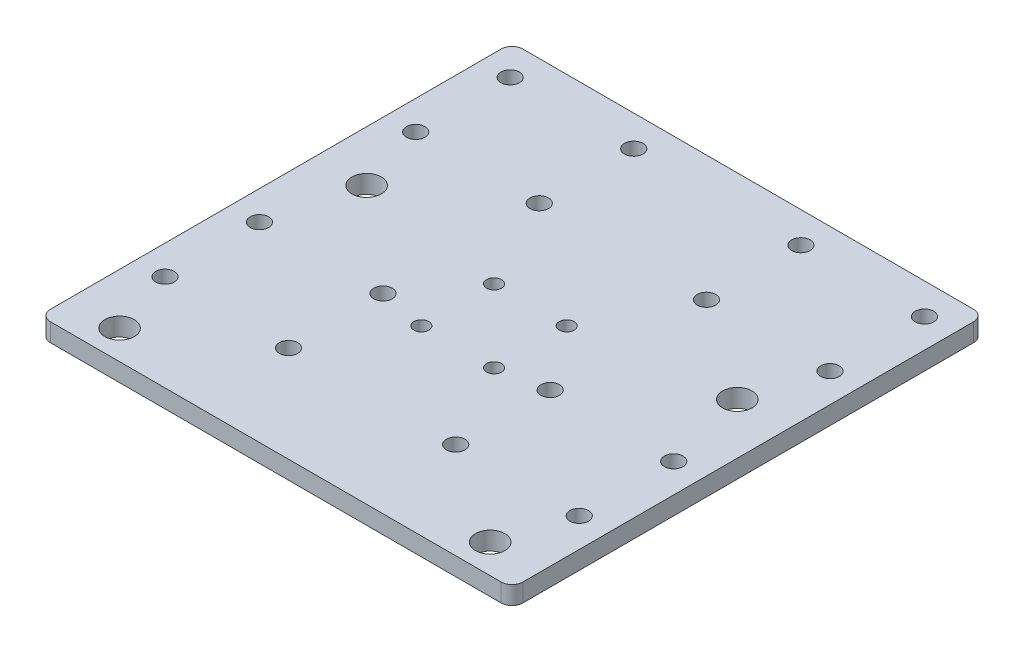
ISO-10303-21;
HEADER;
FILE_DESCRIPTION(('STEP AP214'),'2;1');
FILE_NAME('part.step','',(''),(''),'','','');
FILE_SCHEMA(('AUTOMOTIVE_DESIGN { 1 0 10303 214 1 1 1 1 }'));
ENDSEC;
DATA;
#1=APPLICATION_CONTEXT('core data for automotive mechanical design processes');
#2=APPLICATION_PROTOCOL_DEFINITION('international standard','automotive_design',2000,#1);
#3=PRODUCT_CONTEXT('',#1,'mechanical');
#4=PRODUCT('Part','Part','',(#3));
#5=PRODUCT_RELATED_PRODUCT_CATEGORY('part','',(#4));
#6=PRODUCT_DEFINITION_FORMATION('','',#4);
#7=PRODUCT_DEFINITION_CONTEXT('part definition',#1,'design');
#8=PRODUCT_DEFINITION('design','',#6,#7);
#9=PRODUCT_DEFINITION_SHAPE('','',#8);
#10=(LENGTH_UNIT() NAMED_UNIT(*) SI_UNIT(.MILLI.,.METRE.));
#11=(NAMED_UNIT(*) PLANE_ANGLE_UNIT() SI_UNIT($,.RADIAN.));
#12=(NAMED_UNIT(*) SI_UNIT($,.STERADIAN.) SOLID_ANGLE_UNIT());
#13=UNCERTAINTY_MEASURE_WITH_UNIT(LENGTH_MEASURE(1.E-05),#10,'distance_accuracy_value','');
#14=(GEOMETRIC_REPRESENTATION_CONTEXT(3) GLOBAL_UNCERTAINTY_ASSIGNED_CONTEXT((#13)) GLOBAL_UNIT_ASSIGNED_CONTEXT((#10,
#11,#12)) REPRESENTATION_CONTEXT('',''));
#15=CARTESIAN_POINT('',(0.,0.,0.));
#16=DIRECTION('',(0.,0.,1.));
#17=DIRECTION('',(1.,0.,0.));
#18=AXIS2_PLACEMENT_3D('',#15,#16,#17);
#19=CARTESIAN_POINT('',(0.,5.,0.));
#20=DIRECTION('',(1.,0.,0.));
#21=DIRECTION('',(0.,0.,-1.));
#22=AXIS2_PLACEMENT_3D('',#19,#20,#21);
#23=PLANE('',#22);
#24=DIRECTION('',(0.,0.,1.));
#25=VECTOR('',#24,1.);
#26=CARTESIAN_POINT('',(0.,0.,0.));
#27=LINE('',#26,#25);
#28=CARTESIAN_POINT('',(0.,0.,3.));
#29=VERTEX_POINT('',#28);
#30=CARTESIAN_POINT('',(0.,0.,127.));
#31=VERTEX_POINT('',#30);
#32=EDGE_CURVE('E127',#29,#31,#27,.T.);
#33=ORIENTED_EDGE('',*,*,#32,.T.);
#34=DIRECTION('',(0.,-1.,0.));
#35=VECTOR('',#34,1.);
#36=CARTESIAN_POINT('',(0.,5.,127.));
#37=LINE('',#36,#35);
#38=CARTESIAN_POINT('',(0.,5.,127.));
#39=VERTEX_POINT('',#38);
#40=EDGE_CURVE('E227',#31,#39,#37,.F.);
#41=ORIENTED_EDGE('',*,*,#40,.T.);
#42=DIRECTION('',(0.,0.,1.));
#43=VECTOR('',#42,1.);
#44=CARTESIAN_POINT('',(0.,5.,0.));
#45=LINE('',#44,#43);
#46=CARTESIAN_POINT('',(0.,5.,3.));
#47=VERTEX_POINT('',#46);
#48=EDGE_CURVE('E125',#47,#39,#45,.T.);
#49=ORIENTED_EDGE('',*,*,#48,.F.);
#50=DIRECTION('',(0.,-1.,0.));
#51=VECTOR('',#50,1.);
#52=CARTESIAN_POINT('',(0.,5.,3.));
#53=LINE('',#52,#51);
#54=EDGE_CURVE('E224',#47,#29,#53,.T.);
#55=ORIENTED_EDGE('',*,*,#54,.T.);
#56=EDGE_LOOP('',(#33,#41,#49,#55));
#57=FACE_BOUND('',#56,.T.);
#58=ADVANCED_FACE('F32',(#57),#23,.F.);
#59=CARTESIAN_POINT('',(0.,5.,130.));
#60=DIRECTION('',(0.,0.,-1.));
#61=DIRECTION('',(-1.,0.,0.));
#62=AXIS2_PLACEMENT_3D('',#59,#60,#61);
#63=PLANE('',#62);
#64=DIRECTION('',(1.,0.,0.));
#65=VECTOR('',#64,1.);
#66=CARTESIAN_POINT('',(0.,0.,130.));
#67=LINE('',#66,#65);
#68=CARTESIAN_POINT('',(3.00000000000002,0.,130.));
#69=VERTEX_POINT('',#68);
#70=CARTESIAN_POINT('',(127.,0.,130.));
#71=VERTEX_POINT('',#70);
#72=EDGE_CURVE('E123',#69,#71,#67,.T.);
#73=ORIENTED_EDGE('',*,*,#72,.T.);
#74=DIRECTION('',(0.,-1.,0.));
#75=VECTOR('',#74,1.);
#76=CARTESIAN_POINT('',(127.,5.,130.));
#77=LINE('',#76,#75);
#78=CARTESIAN_POINT('',(127.,5.,130.));
#79=VERTEX_POINT('',#78);
#80=EDGE_CURVE('E102',#71,#79,#77,.F.);
#81=ORIENTED_EDGE('',*,*,#80,.T.);
#82=DIRECTION('',(1.,0.,0.));
#83=VECTOR('',#82,1.);
#84=CARTESIAN_POINT('',(0.,5.,130.));
#85=LINE('',#84,#83);
#86=CARTESIAN_POINT('',(3.00000000000002,5.,130.));
#87=VERTEX_POINT('',#86);
#88=EDGE_CURVE('E243',#87,#79,#85,.T.);
#89=ORIENTED_EDGE('',*,*,#88,.F.);
#90=DIRECTION('',(0.,-1.,0.));
#91=VECTOR('',#90,1.);
#92=CARTESIAN_POINT('',(3.00000000000002,5.,130.));
#93=LINE('',#92,#91);
#94=EDGE_CURVE('E107',#87,#69,#93,.T.);
#95=ORIENTED_EDGE('',*,*,#94,.T.);
#96=EDGE_LOOP('',(#73,#81,#89,#95));
#97=FACE_BOUND('',#96,.T.);
#98=ADVANCED_FACE('F268',(#97),#63,.F.);
#99=CARTESIAN_POINT('',(130.,5.,0.));
#100=DIRECTION('',(-1.,0.,0.));
#101=DIRECTION('',(0.,0.,1.));
#102=AXIS2_PLACEMENT_3D('',#99,#100,#101);
#103=PLANE('',#102);
#104=DIRECTION('',(0.,0.,-1.));
#105=VECTOR('',#104,1.);
#106=CARTESIAN_POINT('',(130.,5.,0.));
#107=LINE('',#106,#105);
#108=CARTESIAN_POINT('',(130.,5.,127.));
#109=VERTEX_POINT('',#108);
#110=CARTESIAN_POINT('',(130.,5.,3.));
#111=VERTEX_POINT('',#110);
#112=EDGE_CURVE('E116',#109,#111,#107,.T.);
#113=ORIENTED_EDGE('',*,*,#112,.F.);
#114=DIRECTION('',(0.,-1.,0.));
#115=VECTOR('',#114,1.);
#116=CARTESIAN_POINT('',(130.,5.,127.));
#117=LINE('',#116,#115);
#118=CARTESIAN_POINT('',(130.,0.,127.));
#119=VERTEX_POINT('',#118);
#120=EDGE_CURVE('E101',#109,#119,#117,.T.);
#121=ORIENTED_EDGE('',*,*,#120,.T.);
#122=DIRECTION('',(0.,0.,-1.));
#123=VECTOR('',#122,1.);
#124=CARTESIAN_POINT('',(130.,0.,0.));
#125=LINE('',#124,#123);
#126=CARTESIAN_POINT('',(130.,0.,3.));
#127=VERTEX_POINT('',#126);
#128=EDGE_CURVE('E114',#119,#127,#125,.T.);
#129=ORIENTED_EDGE('',*,*,#128,.T.);
#130=DIRECTION('',(0.,-1.,0.));
#131=VECTOR('',#130,1.);
#132=CARTESIAN_POINT('',(130.,5.,3.));
#133=LINE('',#132,#131);
#134=EDGE_CURVE('E118',#127,#111,#133,.F.);
#135=ORIENTED_EDGE('',*,*,#134,.T.);
#136=EDGE_LOOP('',(#113,#121,#129,#135));
#137=FACE_BOUND('',#136,.T.);
#138=ADVANCED_FACE('F113',(#137),#103,.F.);
#139=CARTESIAN_POINT('',(0.,5.,0.));
#140=DIRECTION('',(0.,0.,1.));
#141=DIRECTION('',(1.,0.,0.));
#142=AXIS2_PLACEMENT_3D('',#139,#140,#141);
#143=PLANE('',#142);
#144=DIRECTION('',(-1.,0.,0.));
#145=VECTOR('',#144,1.);
#146=CARTESIAN_POINT('',(0.,0.,0.));
#147=LINE('',#146,#145);
#148=CARTESIAN_POINT('',(127.,0.,0.));
#149=VERTEX_POINT('',#148);
#150=CARTESIAN_POINT('',(3.,0.,0.));
#151=VERTEX_POINT('',#150);
#152=EDGE_CURVE('E122',#149,#151,#147,.T.);
#153=ORIENTED_EDGE('',*,*,#152,.T.);
#154=DIRECTION('',(0.,-1.,0.));
#155=VECTOR('',#154,1.);
#156=CARTESIAN_POINT('',(3.,5.,0.));
#157=LINE('',#156,#155);
#158=CARTESIAN_POINT('',(3.,5.,0.));
#159=VERTEX_POINT('',#158);
#160=EDGE_CURVE('E11',#151,#159,#157,.F.);
#161=ORIENTED_EDGE('',*,*,#160,.T.);
#162=DIRECTION('',(-1.,0.,0.));
#163=VECTOR('',#162,1.);
#164=CARTESIAN_POINT('',(0.,5.,0.));
#165=LINE('',#164,#163);
#166=CARTESIAN_POINT('',(127.,5.,0.));
#167=VERTEX_POINT('',#166);
#168=EDGE_CURVE('E208',#167,#159,#165,.T.);
#169=ORIENTED_EDGE('',*,*,#168,.F.);
#170=DIRECTION('',(0.,-1.,0.));
#171=VECTOR('',#170,1.);
#172=CARTESIAN_POINT('',(127.,5.,0.));
#173=LINE('',#172,#171);
#174=EDGE_CURVE('E40',#167,#149,#173,.T.);
#175=ORIENTED_EDGE('',*,*,#174,.T.);
#176=EDGE_LOOP('',(#153,#161,#169,#175));
#177=FACE_BOUND('',#176,.T.);
#178=ADVANCED_FACE('F230',(#177),#143,.F.);
#179=CARTESIAN_POINT('',(0.,5.,0.));
#180=DIRECTION('',(0.,1.,0.));
#181=DIRECTION('',(0.,0.,1.));
#182=AXIS2_PLACEMENT_3D('',#179,#180,#181);
#183=PLANE('',#182);
#184=CARTESIAN_POINT('',(122.002540725745,5.,103.5));
#185=DIRECTION('',(0.,1.,0.));
#186=DIRECTION('',(0.,0.,1.));
#187=AXIS2_PLACEMENT_3D('',#184,#185,#186);
#188=CIRCLE('',#187,2.54999999999999);
#189=CARTESIAN_POINT('',(122.002540725745,5.,106.05));
#190=VERTEX_POINT('',#189);
#191=EDGE_CURVE('E621',#190,#190,#188,.T.);
#192=ORIENTED_EDGE('',*,*,#191,.F.);
#193=EDGE_LOOP('',(#192));
#194=FACE_BOUND('',#193,.T.);
#195=CARTESIAN_POINT('',(122.002540725745,5.,77.5));
#196=DIRECTION('',(0.,1.,0.));
#197=DIRECTION('',(0.,0.,1.));
#198=AXIS2_PLACEMENT_3D('',#195,#196,#197);
#199=CIRCLE('',#198,2.54999999999999);
#200=CARTESIAN_POINT('',(122.002540725745,5.,80.05));
#201=VERTEX_POINT('',#200);
#202=EDGE_CURVE('E636',#201,#201,#199,.T.);
#203=ORIENTED_EDGE('',*,*,#202,.F.);
#204=EDGE_LOOP('',(#203));
#205=FACE_BOUND('',#204,.T.);
#206=CARTESIAN_POINT('',(122.002540725745,5.,8.49999999999997));
#207=DIRECTION('',(0.,1.,0.));
#208=DIRECTION('',(0.,0.,1.));
#209=AXIS2_PLACEMENT_3D('',#206,#207,#208);
#210=CIRCLE('',#209,2.54999999999999);
#211=CARTESIAN_POINT('',(122.002540725745,5.,11.05));
#212=VERTEX_POINT('',#211);
#213=EDGE_CURVE('E633',#212,#212,#210,.T.);
#214=ORIENTED_EDGE('',*,*,#213,.F.);
#215=EDGE_LOOP('',(#214));
#216=FACE_BOUND('',#215,.T.);
#217=CARTESIAN_POINT('',(122.002540725745,5.,34.5));
#218=DIRECTION('',(0.,1.,0.));
#219=DIRECTION('',(0.,0.,1.));
#220=AXIS2_PLACEMENT_3D('',#217,#218,#219);
#221=CIRCLE('',#220,2.54999999999999);
#222=CARTESIAN_POINT('',(122.002540725745,5.,37.05));
#223=VERTEX_POINT('',#222);
#224=EDGE_CURVE('E629',#223,#223,#221,.T.);
#225=ORIENTED_EDGE('',*,*,#224,.F.);
#226=EDGE_LOOP('',(#225));
#227=FACE_BOUND('',#226,.T.);
#228=CARTESIAN_POINT('',(88.002540725745,5.,34.5));
#229=DIRECTION('',(0.,1.,0.));
#230=DIRECTION('',(0.,0.,1.));
#231=AXIS2_PLACEMENT_3D('',#228,#229,#230);
#232=CIRCLE('',#231,2.54999999999999);
#233=CARTESIAN_POINT('',(88.002540725745,5.,37.05));
#234=VERTEX_POINT('',#233);
#235=EDGE_CURVE('E626',#234,#234,#232,.T.);
#236=ORIENTED_EDGE('',*,*,#235,.F.);
#237=EDGE_LOOP('',(#236));
#238=FACE_BOUND('',#237,.T.);
#239=CARTESIAN_POINT('',(55.,5.,79.9415754864367));
#240=DIRECTION('',(0.,1.,0.));
#241=DIRECTION('',(0.,0.,1.));
#242=AXIS2_PLACEMENT_3D('',#239,#240,#241);
#243=CIRCLE('',#242,2.04999999999999);
#244=CARTESIAN_POINT('',(55.,5.,81.9915754864367));
#245=VERTEX_POINT('',#244);
#246=EDGE_CURVE('E647',#245,#245,#243,.T.);
#247=ORIENTED_EDGE('',*,*,#246,.F.);
#248=EDGE_LOOP('',(#247));
#249=FACE_BOUND('',#248,.T.);
#250=CARTESIAN_POINT('',(75.,5.,79.9415754864367));
#251=DIRECTION('',(0.,1.,0.));
#252=DIRECTION('',(0.,0.,1.));
#253=AXIS2_PLACEMENT_3D('',#250,#251,#252);
#254=CIRCLE('',#253,2.04999999999999);
#255=CARTESIAN_POINT('',(75.,5.,81.9915754864367));
#256=VERTEX_POINT('',#255);
#257=EDGE_CURVE('E650',#256,#256,#254,.T.);
#258=ORIENTED_EDGE('',*,*,#257,.F.);
#259=EDGE_LOOP('',(#258));
#260=FACE_BOUND('',#259,.T.);
#261=CARTESIAN_POINT('',(75.,5.,59.9415754864368));
#262=DIRECTION('',(0.,1.,0.));
#263=DIRECTION('',(0.,0.,1.));
#264=AXIS2_PLACEMENT_3D('',#261,#262,#263);
#265=CIRCLE('',#264,2.04999999999999);
#266=CARTESIAN_POINT('',(75.,5.,61.9915754864368));
#267=VERTEX_POINT('',#266);
#268=EDGE_CURVE('E644',#267,#267,#265,.T.);
#269=ORIENTED_EDGE('',*,*,#268,.F.);
#270=EDGE_LOOP('',(#269));
#271=FACE_BOUND('',#270,.T.);
#272=CARTESIAN_POINT('',(55.,5.,59.9415754864368));
#273=DIRECTION('',(0.,1.,0.));
#274=DIRECTION('',(0.,0.,1.));
#275=AXIS2_PLACEMENT_3D('',#272,#273,#274);
#276=CIRCLE('',#275,2.04999999999999);
#277=CARTESIAN_POINT('',(55.,5.,61.9915754864368));
#278=VERTEX_POINT('',#277);
#279=EDGE_CURVE('E641',#278,#278,#276,.T.);
#280=ORIENTED_EDGE('',*,*,#279,.F.);
#281=EDGE_LOOP('',(#280));
#282=FACE_BOUND('',#281,.T.);
#283=CARTESIAN_POINT('',(88.002540725745,5.,8.49999999999998));
#284=DIRECTION('',(0.,1.,0.));
#285=DIRECTION('',(0.,0.,1.));
#286=AXIS2_PLACEMENT_3D('',#283,#284,#285);
#287=CIRCLE('',#286,2.54999999999999);
#288=CARTESIAN_POINT('',(88.002540725745,5.,11.05));
#289=VERTEX_POINT('',#288);
#290=EDGE_CURVE('E630',#289,#289,#287,.T.);
#291=ORIENTED_EDGE('',*,*,#290,.F.);
#292=EDGE_LOOP('',(#291));
#293=FACE_BOUND('',#292,.T.);
#294=CARTESIAN_POINT('',(7.99745927425499,5.,77.5));
#295=DIRECTION('',(0.,1.,0.));
#296=DIRECTION('',(0.,0.,1.));
#297=AXIS2_PLACEMENT_3D('',#294,#295,#296);
#298=CIRCLE('',#297,2.55);
#299=CARTESIAN_POINT('',(7.99745927425499,5.,80.05));
#300=VERTEX_POINT('',#299);
#301=EDGE_CURVE('E605',#300,#300,#298,.T.);
#302=ORIENTED_EDGE('',*,*,#301,.F.);
#303=EDGE_LOOP('',(#302));
#304=FACE_BOUND('',#303,.T.);
#305=CARTESIAN_POINT('',(7.99745927425497,5.,34.5));
#306=DIRECTION('',(0.,1.,0.));
#307=DIRECTION('',(0.,0.,1.));
#308=AXIS2_PLACEMENT_3D('',#305,#306,#307);
#309=CIRCLE('',#308,2.55);
#310=CARTESIAN_POINT('',(7.99745927425497,5.,37.05));
#311=VERTEX_POINT('',#310);
#312=EDGE_CURVE('E602',#311,#311,#309,.T.);
#313=ORIENTED_EDGE('',*,*,#312,.F.);
#314=EDGE_LOOP('',(#313));
#315=FACE_BOUND('',#314,.T.);
#316=CARTESIAN_POINT('',(7.99745927425497,5.,8.49999999999999));
#317=DIRECTION('',(0.,1.,0.));
#318=DIRECTION('',(0.,0.,1.));
#319=AXIS2_PLACEMENT_3D('',#316,#317,#318);
#320=CIRCLE('',#319,2.55);
#321=CARTESIAN_POINT('',(7.99745927425497,5.,11.05));
#322=VERTEX_POINT('',#321);
#323=EDGE_CURVE('E599',#322,#322,#320,.T.);
#324=ORIENTED_EDGE('',*,*,#323,.F.);
#325=EDGE_LOOP('',(#324));
#326=FACE_BOUND('',#325,.T.);
#327=CARTESIAN_POINT('',(41.997459274255,5.,34.5));
#328=DIRECTION('',(0.,1.,0.));
#329=DIRECTION('',(0.,0.,1.));
#330=AXIS2_PLACEMENT_3D('',#327,#328,#329);
#331=CIRCLE('',#330,2.55);
#332=CARTESIAN_POINT('',(41.997459274255,5.,37.05));
#333=VERTEX_POINT('',#332);
#334=EDGE_CURVE('E154',#333,#333,#331,.T.);
#335=ORIENTED_EDGE('',*,*,#334,.F.);
#336=EDGE_LOOP('',(#335));
#337=FACE_BOUND('',#336,.T.);
#338=CARTESIAN_POINT('',(88.002540725745,5.,103.5));
#339=DIRECTION('',(0.,1.,0.));
#340=DIRECTION('',(0.,0.,1.));
#341=AXIS2_PLACEMENT_3D('',#338,#339,#340);
#342=CIRCLE('',#341,2.54999999999999);
#343=CARTESIAN_POINT('',(88.002540725745,5.,106.05));
#344=VERTEX_POINT('',#343);
#345=EDGE_CURVE('E617',#344,#344,#342,.T.);
#346=ORIENTED_EDGE('',*,*,#345,.F.);
#347=EDGE_LOOP('',(#346));
#348=FACE_BOUND('',#347,.T.);
#349=CARTESIAN_POINT('',(88.0025407257451,5.,77.5));
#350=DIRECTION('',(0.,1.,0.));
#351=DIRECTION('',(0.,0.,1.));
#352=AXIS2_PLACEMENT_3D('',#349,#350,#351);
#353=CIRCLE('',#352,2.54999999999999);
#354=CARTESIAN_POINT('',(88.0025407257451,5.,80.05));
#355=VERTEX_POINT('',#354);
#356=EDGE_CURVE('E620',#355,#355,#353,.T.);
#357=ORIENTED_EDGE('',*,*,#356,.F.);
#358=EDGE_LOOP('',(#357));
#359=FACE_BOUND('',#358,.T.);
#360=CARTESIAN_POINT('',(7.99745927425498,5.,103.5));
#361=DIRECTION('',(0.,1.,0.));
#362=DIRECTION('',(0.,0.,1.));
#363=AXIS2_PLACEMENT_3D('',#360,#361,#362);
#364=CIRCLE('',#363,2.55);
#365=CARTESIAN_POINT('',(7.99745927425498,5.,106.05));
#366=VERTEX_POINT('',#365);
#367=EDGE_CURVE('E614',#366,#366,#364,.T.);
#368=ORIENTED_EDGE('',*,*,#367,.F.);
#369=EDGE_LOOP('',(#368));
#370=FACE_BOUND('',#369,.T.);
#371=CARTESIAN_POINT('',(41.997459274255,5.,103.5));
#372=DIRECTION('',(0.,1.,0.));
#373=DIRECTION('',(0.,0.,1.));
#374=AXIS2_PLACEMENT_3D('',#371,#372,#373);
#375=CIRCLE('',#374,2.55);
#376=CARTESIAN_POINT('',(41.997459274255,5.,106.05));
#377=VERTEX_POINT('',#376);
#378=EDGE_CURVE('E611',#377,#377,#375,.T.);
#379=ORIENTED_EDGE('',*,*,#378,.F.);
#380=EDGE_LOOP('',(#379));
#381=FACE_BOUND('',#380,.T.);
#382=CARTESIAN_POINT('',(41.997459274255,5.,77.5));
#383=DIRECTION('',(0.,1.,0.));
#384=DIRECTION('',(0.,0.,1.));
#385=AXIS2_PLACEMENT_3D('',#382,#383,#384);
#386=CIRCLE('',#385,2.55);
#387=CARTESIAN_POINT('',(41.997459274255,5.,80.05));
#388=VERTEX_POINT('',#387);
#389=EDGE_CURVE('E608',#388,#388,#386,.T.);
#390=ORIENTED_EDGE('',*,*,#389,.F.);
#391=EDGE_LOOP('',(#390));
#392=FACE_BOUND('',#391,.T.);
#393=CARTESIAN_POINT('',(41.997459274255,5.,8.49999999999999));
#394=DIRECTION('',(0.,1.,0.));
#395=DIRECTION('',(0.,0.,1.));
#396=AXIS2_PLACEMENT_3D('',#393,#394,#395);
#397=CIRCLE('',#396,2.55);
#398=CARTESIAN_POINT('',(41.997459274255,5.,11.05));
#399=VERTEX_POINT('',#398);
#400=EDGE_CURVE('E149',#399,#399,#397,.T.);
#401=ORIENTED_EDGE('',*,*,#400,.F.);
#402=EDGE_LOOP('',(#401));
#403=FACE_BOUND('',#402,.T.);
#404=CARTESIAN_POINT('',(116.,5.,53.9999999999999));
#405=DIRECTION('',(0.,1.,0.));
#406=DIRECTION('',(0.,0.,1.));
#407=AXIS2_PLACEMENT_3D('',#404,#405,#406);
#408=CIRCLE('',#407,4.05);
#409=CARTESIAN_POINT('',(116.,5.,58.0499999999999));
#410=VERTEX_POINT('',#409);
#411=EDGE_CURVE('E139',#410,#410,#408,.T.);
#412=ORIENTED_EDGE('',*,*,#411,.F.);
#413=EDGE_LOOP('',(#412));
#414=FACE_BOUND('',#413,.T.);
#415=CARTESIAN_POINT('',(116.,5.,122.));
#416=DIRECTION('',(0.,1.,0.));
#417=DIRECTION('',(0.,0.,1.));
#418=AXIS2_PLACEMENT_3D('',#415,#416,#417);
#419=CIRCLE('',#418,4.05);
#420=CARTESIAN_POINT('',(116.,5.,126.05));
#421=VERTEX_POINT('',#420);
#422=EDGE_CURVE('E591',#421,#421,#419,.T.);
#423=ORIENTED_EDGE('',*,*,#422,.F.);
#424=EDGE_LOOP('',(#423));
#425=FACE_BOUND('',#424,.T.);
#426=CARTESIAN_POINT('',(14.0000000000008,5.,121.999999999998));
#427=DIRECTION('',(0.,1.,0.));
#428=DIRECTION('',(0.,0.,1.));
#429=AXIS2_PLACEMENT_3D('',#426,#427,#428);
#430=CIRCLE('',#429,4.05);
#431=CARTESIAN_POINT('',(14.0000000000008,5.,126.049999999998));
#432=VERTEX_POINT('',#431);
#433=EDGE_CURVE('E148',#432,#432,#430,.T.);
#434=ORIENTED_EDGE('',*,*,#433,.F.);
#435=EDGE_LOOP('',(#434));
#436=FACE_BOUND('',#435,.T.);
#437=CARTESIAN_POINT('',(14.0000000000002,5.,54.0000000000003));
#438=DIRECTION('',(0.,1.,0.));
#439=DIRECTION('',(0.,0.,1.));
#440=AXIS2_PLACEMENT_3D('',#437,#438,#439);
#441=CIRCLE('',#440,4.05);
#442=CARTESIAN_POINT('',(14.0000000000002,5.,58.0500000000003));
#443=VERTEX_POINT('',#442);
#444=EDGE_CURVE('E134',#443,#443,#441,.T.);
#445=ORIENTED_EDGE('',*,*,#444,.F.);
#446=EDGE_LOOP('',(#445));
#447=FACE_BOUND('',#446,.T.);
#448=ORIENTED_EDGE('',*,*,#88,.T.);
#449=CARTESIAN_POINT('',(127.,5.,127.));
#450=DIRECTION('',(0.,1.,0.));
#451=DIRECTION('',(0.,0.,1.));
#452=AXIS2_PLACEMENT_3D('',#449,#450,#451);
#453=CIRCLE('',#452,3.);
#454=EDGE_CURVE('E222',#79,#109,#453,.T.);
#455=ORIENTED_EDGE('',*,*,#454,.T.);
#456=ORIENTED_EDGE('',*,*,#112,.T.);
#457=CARTESIAN_POINT('',(127.,5.,3.));
#458=DIRECTION('',(0.,1.,0.));
#459=DIRECTION('',(0.,0.,1.));
#460=AXIS2_PLACEMENT_3D('',#457,#458,#459);
#461=CIRCLE('',#460,3.);
#462=EDGE_CURVE('E52',#111,#167,#461,.T.);
#463=ORIENTED_EDGE('',*,*,#462,.T.);
#464=ORIENTED_EDGE('',*,*,#168,.T.);
#465=CARTESIAN_POINT('',(3.,5.,3.));
#466=DIRECTION('',(0.,1.,0.));
#467=DIRECTION('',(0.,0.,1.));
#468=AXIS2_PLACEMENT_3D('',#465,#466,#467);
#469=CIRCLE('',#468,3.);
#470=EDGE_CURVE('E218',#159,#47,#469,.T.);
#471=ORIENTED_EDGE('',*,*,#470,.T.);
#472=ORIENTED_EDGE('',*,*,#48,.T.);
#473=CARTESIAN_POINT('',(3.00000000000002,5.,127.));
#474=DIRECTION('',(0.,1.,0.));
#475=DIRECTION('',(0.,0.,1.));
#476=AXIS2_PLACEMENT_3D('',#473,#474,#475);
#477=CIRCLE('',#476,3.);
#478=EDGE_CURVE('E220',#39,#87,#477,.T.);
#479=ORIENTED_EDGE('',*,*,#478,.T.);
#480=EDGE_LOOP('',(#448,#455,#456,#463,#464,#471,#472,#479));
#481=FACE_BOUND('',#480,.T.);
#482=ADVANCED_FACE('F251',(#194,#205,#216,#227,#238,#249,#260,#271,#282,#293,#304,#315,#326,
#337,#348,#359,#370,#381,#392,#403,#414,#425,#436,#447,#481),#183,.T.);
#483=CARTESIAN_POINT('',(0.,0.,0.));
#484=DIRECTION('',(0.,1.,0.));
#485=DIRECTION('',(0.,0.,1.));
#486=AXIS2_PLACEMENT_3D('',#483,#484,#485);
#487=PLANE('',#486);
#488=CARTESIAN_POINT('',(122.002540725745,0.,103.5));
#489=DIRECTION('',(0.,1.,0.));
#490=DIRECTION('',(0.,0.,1.));
#491=AXIS2_PLACEMENT_3D('',#488,#489,#490);
#492=CIRCLE('',#491,2.54999999999999);
#493=CARTESIAN_POINT('',(122.002540725745,0.,106.05));
#494=VERTEX_POINT('',#493);
#495=EDGE_CURVE('E205',#494,#494,#492,.T.);
#496=ORIENTED_EDGE('',*,*,#495,.T.);
#497=EDGE_LOOP('',(#496));
#498=FACE_BOUND('',#497,.T.);
#499=CARTESIAN_POINT('',(122.002540725745,0.,77.5));
#500=DIRECTION('',(0.,1.,0.));
#501=DIRECTION('',(0.,0.,1.));
#502=AXIS2_PLACEMENT_3D('',#499,#500,#501);
#503=CIRCLE('',#502,2.54999999999999);
#504=CARTESIAN_POINT('',(122.002540725745,0.,80.05));
#505=VERTEX_POINT('',#504);
#506=EDGE_CURVE('E202',#505,#505,#503,.T.);
#507=ORIENTED_EDGE('',*,*,#506,.T.);
#508=EDGE_LOOP('',(#507));
#509=FACE_BOUND('',#508,.T.);
#510=CARTESIAN_POINT('',(122.002540725745,0.,8.49999999999997));
#511=DIRECTION('',(0.,1.,0.));
#512=DIRECTION('',(0.,0.,1.));
#513=AXIS2_PLACEMENT_3D('',#510,#511,#512);
#514=CIRCLE('',#513,2.54999999999999);
#515=CARTESIAN_POINT('',(122.002540725745,0.,11.05));
#516=VERTEX_POINT('',#515);
#517=EDGE_CURVE('E199',#516,#516,#514,.T.);
#518=ORIENTED_EDGE('',*,*,#517,.T.);
#519=EDGE_LOOP('',(#518));
#520=FACE_BOUND('',#519,.T.);
#521=CARTESIAN_POINT('',(122.002540725745,0.,34.5));
#522=DIRECTION('',(0.,1.,0.));
#523=DIRECTION('',(0.,0.,1.));
#524=AXIS2_PLACEMENT_3D('',#521,#522,#523);
#525=CIRCLE('',#524,2.54999999999999);
#526=CARTESIAN_POINT('',(122.002540725745,0.,37.05));
#527=VERTEX_POINT('',#526);
#528=EDGE_CURVE('E196',#527,#527,#525,.T.);
#529=ORIENTED_EDGE('',*,*,#528,.T.);
#530=EDGE_LOOP('',(#529));
#531=FACE_BOUND('',#530,.T.);
#532=CARTESIAN_POINT('',(88.002540725745,0.,34.5));
#533=DIRECTION('',(0.,1.,0.));
#534=DIRECTION('',(0.,0.,1.));
#535=AXIS2_PLACEMENT_3D('',#532,#533,#534);
#536=CIRCLE('',#535,2.54999999999999);
#537=CARTESIAN_POINT('',(88.002540725745,0.,37.05));
#538=VERTEX_POINT('',#537);
#539=EDGE_CURVE('E193',#538,#538,#536,.T.);
#540=ORIENTED_EDGE('',*,*,#539,.T.);
#541=EDGE_LOOP('',(#540));
#542=FACE_BOUND('',#541,.T.);
#543=CARTESIAN_POINT('',(55.,0.,79.9415754864367));
#544=DIRECTION('',(0.,1.,0.));
#545=DIRECTION('',(0.,0.,1.));
#546=AXIS2_PLACEMENT_3D('',#543,#544,#545);
#547=CIRCLE('',#546,2.04999999999999);
#548=CARTESIAN_POINT('',(55.,0.,81.9915754864367));
#549=VERTEX_POINT('',#548);
#550=EDGE_CURVE('E190',#549,#549,#547,.T.);
#551=ORIENTED_EDGE('',*,*,#550,.T.);
#552=EDGE_LOOP('',(#551));
#553=FACE_BOUND('',#552,.T.);
#554=CARTESIAN_POINT('',(75.,0.,79.9415754864367));
#555=DIRECTION('',(0.,1.,0.));
#556=DIRECTION('',(0.,0.,1.));
#557=AXIS2_PLACEMENT_3D('',#554,#555,#556);
#558=CIRCLE('',#557,2.04999999999999);
#559=CARTESIAN_POINT('',(75.,0.,81.9915754864367));
#560=VERTEX_POINT('',#559);
#561=EDGE_CURVE('E187',#560,#560,#558,.T.);
#562=ORIENTED_EDGE('',*,*,#561,.T.);
#563=EDGE_LOOP('',(#562));
#564=FACE_BOUND('',#563,.T.);
#565=CARTESIAN_POINT('',(75.,0.,59.9415754864368));
#566=DIRECTION('',(0.,1.,0.));
#567=DIRECTION('',(0.,0.,1.));
#568=AXIS2_PLACEMENT_3D('',#565,#566,#567);
#569=CIRCLE('',#568,2.04999999999999);
#570=CARTESIAN_POINT('',(75.,0.,61.9915754864368));
#571=VERTEX_POINT('',#570);
#572=EDGE_CURVE('E184',#571,#571,#569,.T.);
#573=ORIENTED_EDGE('',*,*,#572,.T.);
#574=EDGE_LOOP('',(#573));
#575=FACE_BOUND('',#574,.T.);
#576=CARTESIAN_POINT('',(55.,0.,59.9415754864368));
#577=DIRECTION('',(0.,1.,0.));
#578=DIRECTION('',(0.,0.,1.));
#579=AXIS2_PLACEMENT_3D('',#576,#577,#578);
#580=CIRCLE('',#579,2.04999999999999);
#581=CARTESIAN_POINT('',(55.,0.,61.9915754864368));
#582=VERTEX_POINT('',#581);
#583=EDGE_CURVE('E181',#582,#582,#580,.T.);
#584=ORIENTED_EDGE('',*,*,#583,.T.);
#585=EDGE_LOOP('',(#584));
#586=FACE_BOUND('',#585,.T.);
#587=CARTESIAN_POINT('',(88.002540725745,0.,8.49999999999998));
#588=DIRECTION('',(0.,1.,0.));
#589=DIRECTION('',(0.,0.,1.));
#590=AXIS2_PLACEMENT_3D('',#587,#588,#589);
#591=CIRCLE('',#590,2.54999999999999);
#592=CARTESIAN_POINT('',(88.002540725745,0.,11.05));
#593=VERTEX_POINT('',#592);
#594=EDGE_CURVE('E178',#593,#593,#591,.T.);
#595=ORIENTED_EDGE('',*,*,#594,.T.);
#596=EDGE_LOOP('',(#595));
#597=FACE_BOUND('',#596,.T.);
#598=CARTESIAN_POINT('',(7.99745927425499,0.,77.5));
#599=DIRECTION('',(0.,1.,0.));
#600=DIRECTION('',(0.,0.,1.));
#601=AXIS2_PLACEMENT_3D('',#598,#599,#600);
#602=CIRCLE('',#601,2.55);
#603=CARTESIAN_POINT('',(7.99745927425499,0.,80.05));
#604=VERTEX_POINT('',#603);
#605=EDGE_CURVE('E175',#604,#604,#602,.T.);
#606=ORIENTED_EDGE('',*,*,#605,.T.);
#607=EDGE_LOOP('',(#606));
#608=FACE_BOUND('',#607,.T.);
#609=CARTESIAN_POINT('',(7.99745927425497,0.,34.5));
#610=DIRECTION('',(0.,1.,0.));
#611=DIRECTION('',(0.,0.,1.));
#612=AXIS2_PLACEMENT_3D('',#609,#610,#611);
#613=CIRCLE('',#612,2.55);
#614=CARTESIAN_POINT('',(7.99745927425497,0.,37.05));
#615=VERTEX_POINT('',#614);
#616=EDGE_CURVE('E172',#615,#615,#613,.T.);
#617=ORIENTED_EDGE('',*,*,#616,.T.);
#618=EDGE_LOOP('',(#617));
#619=FACE_BOUND('',#618,.T.);
#620=CARTESIAN_POINT('',(7.99745927425497,0.,8.49999999999999));
#621=DIRECTION('',(0.,1.,0.));
#622=DIRECTION('',(0.,0.,1.));
#623=AXIS2_PLACEMENT_3D('',#620,#621,#622);
#624=CIRCLE('',#623,2.55);
#625=CARTESIAN_POINT('',(7.99745927425497,0.,11.05));
#626=VERTEX_POINT('',#625);
#627=EDGE_CURVE('E169',#626,#626,#624,.T.);
#628=ORIENTED_EDGE('',*,*,#627,.T.);
#629=EDGE_LOOP('',(#628));
#630=FACE_BOUND('',#629,.T.);
#631=CARTESIAN_POINT('',(41.997459274255,0.,34.5));
#632=DIRECTION('',(0.,1.,0.));
#633=DIRECTION('',(0.,0.,1.));
#634=AXIS2_PLACEMENT_3D('',#631,#632,#633);
#635=CIRCLE('',#634,2.55);
#636=CARTESIAN_POINT('',(41.997459274255,0.,37.05));
#637=VERTEX_POINT('',#636);
#638=EDGE_CURVE('E166',#637,#637,#635,.T.);
#639=ORIENTED_EDGE('',*,*,#638,.T.);
#640=EDGE_LOOP('',(#639));
#641=FACE_BOUND('',#640,.T.);
#642=CARTESIAN_POINT('',(88.002540725745,0.,103.5));
#643=DIRECTION('',(0.,1.,0.));
#644=DIRECTION('',(0.,0.,1.));
#645=AXIS2_PLACEMENT_3D('',#642,#643,#644);
#646=CIRCLE('',#645,2.54999999999999);
#647=CARTESIAN_POINT('',(88.002540725745,0.,106.05));
#648=VERTEX_POINT('',#647);
#649=EDGE_CURVE('E163',#648,#648,#646,.T.);
#650=ORIENTED_EDGE('',*,*,#649,.T.);
#651=EDGE_LOOP('',(#650));
#652=FACE_BOUND('',#651,.T.);
#653=CARTESIAN_POINT('',(88.0025407257451,0.,77.5));
#654=DIRECTION('',(0.,1.,0.));
#655=DIRECTION('',(0.,0.,1.));
#656=AXIS2_PLACEMENT_3D('',#653,#654,#655);
#657=CIRCLE('',#656,2.54999999999999);
#658=CARTESIAN_POINT('',(88.0025407257451,0.,80.05));
#659=VERTEX_POINT('',#658);
#660=EDGE_CURVE('E160',#659,#659,#657,.T.);
#661=ORIENTED_EDGE('',*,*,#660,.T.);
#662=EDGE_LOOP('',(#661));
#663=FACE_BOUND('',#662,.T.);
#664=CARTESIAN_POINT('',(7.99745927425498,0.,103.5));
#665=DIRECTION('',(0.,1.,0.));
#666=DIRECTION('',(0.,0.,1.));
#667=AXIS2_PLACEMENT_3D('',#664,#665,#666);
#668=CIRCLE('',#667,2.55);
#669=CARTESIAN_POINT('',(7.99745927425498,0.,106.05));
#670=VERTEX_POINT('',#669);
#671=EDGE_CURVE('E157',#670,#670,#668,.T.);
#672=ORIENTED_EDGE('',*,*,#671,.T.);
#673=EDGE_LOOP('',(#672));
#674=FACE_BOUND('',#673,.T.);
#675=CARTESIAN_POINT('',(41.997459274255,0.,103.5));
#676=DIRECTION('',(0.,1.,0.));
#677=DIRECTION('',(0.,0.,1.));
#678=AXIS2_PLACEMENT_3D('',#675,#676,#677);
#679=CIRCLE('',#678,2.55);
#680=CARTESIAN_POINT('',(41.997459274255,0.,106.05));
#681=VERTEX_POINT('',#680);
#682=EDGE_CURVE('E153',#681,#681,#679,.T.);
#683=ORIENTED_EDGE('',*,*,#682,.T.);
#684=EDGE_LOOP('',(#683));
#685=FACE_BOUND('',#684,.T.);
#686=CARTESIAN_POINT('',(41.997459274255,0.,77.5));
#687=DIRECTION('',(0.,1.,0.));
#688=DIRECTION('',(0.,0.,1.));
#689=AXIS2_PLACEMENT_3D('',#686,#687,#688);
#690=CIRCLE('',#689,2.55);
#691=CARTESIAN_POINT('',(41.997459274255,0.,80.05));
#692=VERTEX_POINT('',#691);
#693=EDGE_CURVE('E150',#692,#692,#690,.T.);
#694=ORIENTED_EDGE('',*,*,#693,.T.);
#695=EDGE_LOOP('',(#694));
#696=FACE_BOUND('',#695,.T.);
#697=CARTESIAN_POINT('',(41.997459274255,0.,8.49999999999999));
#698=DIRECTION('',(0.,1.,0.));
#699=DIRECTION('',(0.,0.,1.));
#700=AXIS2_PLACEMENT_3D('',#697,#698,#699);
#701=CIRCLE('',#700,2.55);
#702=CARTESIAN_POINT('',(41.997459274255,0.,11.05));
#703=VERTEX_POINT('',#702);
#704=EDGE_CURVE('E145',#703,#703,#701,.T.);
#705=ORIENTED_EDGE('',*,*,#704,.T.);
#706=EDGE_LOOP('',(#705));
#707=FACE_BOUND('',#706,.T.);
#708=CARTESIAN_POINT('',(116.,0.,53.9999999999999));
#709=DIRECTION('',(0.,1.,0.));
#710=DIRECTION('',(0.,0.,1.));
#711=AXIS2_PLACEMENT_3D('',#708,#709,#710);
#712=CIRCLE('',#711,4.05);
#713=CARTESIAN_POINT('',(116.,0.,58.0499999999999));
#714=VERTEX_POINT('',#713);
#715=EDGE_CURVE('E142',#714,#714,#712,.T.);
#716=ORIENTED_EDGE('',*,*,#715,.T.);
#717=EDGE_LOOP('',(#716));
#718=FACE_BOUND('',#717,.T.);
#719=CARTESIAN_POINT('',(116.,0.,122.));
#720=DIRECTION('',(0.,1.,0.));
#721=DIRECTION('',(0.,0.,1.));
#722=AXIS2_PLACEMENT_3D('',#719,#720,#721);
#723=CIRCLE('',#722,4.05);
#724=CARTESIAN_POINT('',(116.,0.,126.05));
#725=VERTEX_POINT('',#724);
#726=EDGE_CURVE('E138',#725,#725,#723,.T.);
#727=ORIENTED_EDGE('',*,*,#726,.T.);
#728=EDGE_LOOP('',(#727));
#729=FACE_BOUND('',#728,.T.);
#730=CARTESIAN_POINT('',(14.0000000000008,0.,121.999999999998));
#731=DIRECTION('',(0.,1.,0.));
#732=DIRECTION('',(0.,0.,1.));
#733=AXIS2_PLACEMENT_3D('',#730,#731,#732);
#734=CIRCLE('',#733,4.05);
#735=CARTESIAN_POINT('',(14.0000000000008,0.,126.049999999998));
#736=VERTEX_POINT('',#735);
#737=EDGE_CURVE('E135',#736,#736,#734,.T.);
#738=ORIENTED_EDGE('',*,*,#737,.T.);
#739=EDGE_LOOP('',(#738));
#740=FACE_BOUND('',#739,.T.);
#741=CARTESIAN_POINT('',(14.0000000000002,0.,54.0000000000003));
#742=DIRECTION('',(0.,1.,0.));
#743=DIRECTION('',(0.,0.,1.));
#744=AXIS2_PLACEMENT_3D('',#741,#742,#743);
#745=CIRCLE('',#744,4.05);
#746=CARTESIAN_POINT('',(14.0000000000002,0.,58.0500000000003));
#747=VERTEX_POINT('',#746);
#748=EDGE_CURVE('E131',#747,#747,#745,.T.);
#749=ORIENTED_EDGE('',*,*,#748,.T.);
#750=EDGE_LOOP('',(#749));
#751=FACE_BOUND('',#750,.T.);
#752=ORIENTED_EDGE('',*,*,#128,.F.);
#753=CARTESIAN_POINT('',(127.,0.,127.));
#754=DIRECTION('',(0.,1.,0.));
#755=DIRECTION('',(0.,0.,1.));
#756=AXIS2_PLACEMENT_3D('',#753,#754,#755);
#757=CIRCLE('',#756,3.);
#758=EDGE_CURVE('E97',#119,#71,#757,.F.);
#759=ORIENTED_EDGE('',*,*,#758,.T.);
#760=ORIENTED_EDGE('',*,*,#72,.F.);
#761=CARTESIAN_POINT('',(3.00000000000002,0.,127.));
#762=DIRECTION('',(0.,1.,0.));
#763=DIRECTION('',(0.,0.,1.));
#764=AXIS2_PLACEMENT_3D('',#761,#762,#763);
#765=CIRCLE('',#764,3.);
#766=EDGE_CURVE('E108',#69,#31,#765,.F.);
#767=ORIENTED_EDGE('',*,*,#766,.T.);
#768=ORIENTED_EDGE('',*,*,#32,.F.);
#769=CARTESIAN_POINT('',(3.,0.,3.));
#770=DIRECTION('',(0.,1.,0.));
#771=DIRECTION('',(0.,0.,1.));
#772=AXIS2_PLACEMENT_3D('',#769,#770,#771);
#773=CIRCLE('',#772,3.);
#774=EDGE_CURVE('E211',#29,#151,#773,.F.);
#775=ORIENTED_EDGE('',*,*,#774,.T.);
#776=ORIENTED_EDGE('',*,*,#152,.F.);
#777=CARTESIAN_POINT('',(127.,0.,3.));
#778=DIRECTION('',(0.,1.,0.));
#779=DIRECTION('',(0.,0.,1.));
#780=AXIS2_PLACEMENT_3D('',#777,#778,#779);
#781=CIRCLE('',#780,3.);
#782=EDGE_CURVE('E117',#149,#127,#781,.F.);
#783=ORIENTED_EDGE('',*,*,#782,.T.);
#784=EDGE_LOOP('',(#752,#759,#760,#767,#768,#775,#776,#783));
#785=FACE_BOUND('',#784,.T.);
#786=ADVANCED_FACE('F120',(#498,#509,#520,#531,#542,#553,#564,#575,#586,#597,#608,#619,#630,
#641,#652,#663,#674,#685,#696,#707,#718,#729,#740,#751,#785),#487,.F.);
#787=CARTESIAN_POINT('',(14.0000000000002,-5.,54.0000000000003));
#788=DIRECTION('',(0.,1.,0.));
#789=DIRECTION('',(0.,0.,1.));
#790=AXIS2_PLACEMENT_3D('',#787,#788,#789);
#791=CYLINDRICAL_SURFACE('',#790,4.05);
#792=ORIENTED_EDGE('',*,*,#444,.T.);
#793=EDGE_LOOP('',(#792));
#794=FACE_BOUND('',#793,.T.);
#795=ORIENTED_EDGE('',*,*,#748,.F.);
#796=EDGE_LOOP('',(#795));
#797=FACE_BOUND('',#796,.T.);
#798=ADVANCED_FACE('F260',(#794,#797),#791,.F.);
#799=CARTESIAN_POINT('',(14.0000000000008,-5.,121.999999999998));
#800=DIRECTION('',(0.,1.,0.));
#801=DIRECTION('',(0.,0.,1.));
#802=AXIS2_PLACEMENT_3D('',#799,#800,#801);
#803=CYLINDRICAL_SURFACE('',#802,4.05);
#804=ORIENTED_EDGE('',*,*,#433,.T.);
#805=EDGE_LOOP('',(#804));
#806=FACE_BOUND('',#805,.T.);
#807=ORIENTED_EDGE('',*,*,#737,.F.);
#808=EDGE_LOOP('',(#807));
#809=FACE_BOUND('',#808,.T.);
#810=ADVANCED_FACE('F559',(#806,#809),#803,.F.);
#811=CARTESIAN_POINT('',(116.,-5.,122.));
#812=DIRECTION('',(0.,1.,0.));
#813=DIRECTION('',(0.,0.,1.));
#814=AXIS2_PLACEMENT_3D('',#811,#812,#813);
#815=CYLINDRICAL_SURFACE('',#814,4.05);
#816=ORIENTED_EDGE('',*,*,#422,.T.);
#817=EDGE_LOOP('',(#816));
#818=FACE_BOUND('',#817,.T.);
#819=ORIENTED_EDGE('',*,*,#726,.F.);
#820=EDGE_LOOP('',(#819));
#821=FACE_BOUND('',#820,.T.);
#822=ADVANCED_FACE('F549',(#818,#821),#815,.F.);
#823=CARTESIAN_POINT('',(116.,-5.,53.9999999999999));
#824=DIRECTION('',(0.,1.,0.));
#825=DIRECTION('',(0.,0.,1.));
#826=AXIS2_PLACEMENT_3D('',#823,#824,#825);
#827=CYLINDRICAL_SURFACE('',#826,4.05);
#828=ORIENTED_EDGE('',*,*,#411,.T.);
#829=EDGE_LOOP('',(#828));
#830=FACE_BOUND('',#829,.T.);
#831=ORIENTED_EDGE('',*,*,#715,.F.);
#832=EDGE_LOOP('',(#831));
#833=FACE_BOUND('',#832,.T.);
#834=ADVANCED_FACE('F539',(#830,#833),#827,.F.);
#835=CARTESIAN_POINT('',(41.997459274255,-5.,8.49999999999999));
#836=DIRECTION('',(0.,1.,0.));
#837=DIRECTION('',(0.,0.,1.));
#838=AXIS2_PLACEMENT_3D('',#835,#836,#837);
#839=CYLINDRICAL_SURFACE('',#838,2.55);
#840=ORIENTED_EDGE('',*,*,#400,.T.);
#841=EDGE_LOOP('',(#840));
#842=FACE_BOUND('',#841,.T.);
#843=ORIENTED_EDGE('',*,*,#704,.F.);
#844=EDGE_LOOP('',(#843));
#845=FACE_BOUND('',#844,.T.);
#846=ADVANCED_FACE('F529',(#842,#845),#839,.F.);
#847=CARTESIAN_POINT('',(41.997459274255,-5.,77.5));
#848=DIRECTION('',(0.,1.,0.));
#849=DIRECTION('',(0.,0.,1.));
#850=AXIS2_PLACEMENT_3D('',#847,#848,#849);
#851=CYLINDRICAL_SURFACE('',#850,2.55);
#852=ORIENTED_EDGE('',*,*,#389,.T.);
#853=EDGE_LOOP('',(#852));
#854=FACE_BOUND('',#853,.T.);
#855=ORIENTED_EDGE('',*,*,#693,.F.);
#856=EDGE_LOOP('',(#855));
#857=FACE_BOUND('',#856,.T.);
#858=ADVANCED_FACE('F519',(#854,#857),#851,.F.);
#859=CARTESIAN_POINT('',(41.997459274255,-5.,103.5));
#860=DIRECTION('',(0.,1.,0.));
#861=DIRECTION('',(0.,0.,1.));
#862=AXIS2_PLACEMENT_3D('',#859,#860,#861);
#863=CYLINDRICAL_SURFACE('',#862,2.55);
#864=ORIENTED_EDGE('',*,*,#378,.T.);
#865=EDGE_LOOP('',(#864));
#866=FACE_BOUND('',#865,.T.);
#867=ORIENTED_EDGE('',*,*,#682,.F.);
#868=EDGE_LOOP('',(#867));
#869=FACE_BOUND('',#868,.T.);
#870=ADVANCED_FACE('F509',(#866,#869),#863,.F.);
#871=CARTESIAN_POINT('',(7.99745927425498,-5.,103.5));
#872=DIRECTION('',(0.,1.,0.));
#873=DIRECTION('',(0.,0.,1.));
#874=AXIS2_PLACEMENT_3D('',#871,#872,#873);
#875=CYLINDRICAL_SURFACE('',#874,2.55);
#876=ORIENTED_EDGE('',*,*,#367,.T.);
#877=EDGE_LOOP('',(#876));
#878=FACE_BOUND('',#877,.T.);
#879=ORIENTED_EDGE('',*,*,#671,.F.);
#880=EDGE_LOOP('',(#879));
#881=FACE_BOUND('',#880,.T.);
#882=ADVANCED_FACE('F499',(#878,#881),#875,.F.);
#883=CARTESIAN_POINT('',(88.0025407257451,-5.,77.5));
#884=DIRECTION('',(0.,1.,0.));
#885=DIRECTION('',(0.,0.,1.));
#886=AXIS2_PLACEMENT_3D('',#883,#884,#885);
#887=CYLINDRICAL_SURFACE('',#886,2.54999999999999);
#888=ORIENTED_EDGE('',*,*,#356,.T.);
#889=EDGE_LOOP('',(#888));
#890=FACE_BOUND('',#889,.T.);
#891=ORIENTED_EDGE('',*,*,#660,.F.);
#892=EDGE_LOOP('',(#891));
#893=FACE_BOUND('',#892,.T.);
#894=ADVANCED_FACE('F489',(#890,#893),#887,.F.);
#895=CARTESIAN_POINT('',(88.002540725745,-5.,103.5));
#896=DIRECTION('',(0.,1.,0.));
#897=DIRECTION('',(0.,0.,1.));
#898=AXIS2_PLACEMENT_3D('',#895,#896,#897);
#899=CYLINDRICAL_SURFACE('',#898,2.54999999999999);
#900=ORIENTED_EDGE('',*,*,#345,.T.);
#901=EDGE_LOOP('',(#900));
#902=FACE_BOUND('',#901,.T.);
#903=ORIENTED_EDGE('',*,*,#649,.F.);
#904=EDGE_LOOP('',(#903));
#905=FACE_BOUND('',#904,.T.);
#906=ADVANCED_FACE('F479',(#902,#905),#899,.F.);
#907=CARTESIAN_POINT('',(41.997459274255,-5.,34.5));
#908=DIRECTION('',(0.,1.,0.));
#909=DIRECTION('',(0.,0.,1.));
#910=AXIS2_PLACEMENT_3D('',#907,#908,#909);
#911=CYLINDRICAL_SURFACE('',#910,2.55);
#912=ORIENTED_EDGE('',*,*,#334,.T.);
#913=EDGE_LOOP('',(#912));
#914=FACE_BOUND('',#913,.T.);
#915=ORIENTED_EDGE('',*,*,#638,.F.);
#916=EDGE_LOOP('',(#915));
#917=FACE_BOUND('',#916,.T.);
#918=ADVANCED_FACE('F469',(#914,#917),#911,.F.);
#919=CARTESIAN_POINT('',(7.99745927425497,-5.,8.49999999999999));
#920=DIRECTION('',(0.,1.,0.));
#921=DIRECTION('',(0.,0.,1.));
#922=AXIS2_PLACEMENT_3D('',#919,#920,#921);
#923=CYLINDRICAL_SURFACE('',#922,2.55);
#924=ORIENTED_EDGE('',*,*,#323,.T.);
#925=EDGE_LOOP('',(#924));
#926=FACE_BOUND('',#925,.T.);
#927=ORIENTED_EDGE('',*,*,#627,.F.);
#928=EDGE_LOOP('',(#927));
#929=FACE_BOUND('',#928,.T.);
#930=ADVANCED_FACE('F459',(#926,#929),#923,.F.);
#931=CARTESIAN_POINT('',(7.99745927425497,-5.,34.5));
#932=DIRECTION('',(0.,1.,0.));
#933=DIRECTION('',(0.,0.,1.));
#934=AXIS2_PLACEMENT_3D('',#931,#932,#933);
#935=CYLINDRICAL_SURFACE('',#934,2.55);
#936=ORIENTED_EDGE('',*,*,#312,.T.);
#937=EDGE_LOOP('',(#936));
#938=FACE_BOUND('',#937,.T.);
#939=ORIENTED_EDGE('',*,*,#616,.F.);
#940=EDGE_LOOP('',(#939));
#941=FACE_BOUND('',#940,.T.);
#942=ADVANCED_FACE('F449',(#938,#941),#935,.F.);
#943=CARTESIAN_POINT('',(7.99745927425499,-5.,77.5));
#944=DIRECTION('',(0.,1.,0.));
#945=DIRECTION('',(0.,0.,1.));
#946=AXIS2_PLACEMENT_3D('',#943,#944,#945);
#947=CYLINDRICAL_SURFACE('',#946,2.55);
#948=ORIENTED_EDGE('',*,*,#301,.T.);
#949=EDGE_LOOP('',(#948));
#950=FACE_BOUND('',#949,.T.);
#951=ORIENTED_EDGE('',*,*,#605,.F.);
#952=EDGE_LOOP('',(#951));
#953=FACE_BOUND('',#952,.T.);
#954=ADVANCED_FACE('F439',(#950,#953),#947,.F.);
#955=CARTESIAN_POINT('',(88.002540725745,-5.,8.49999999999998));
#956=DIRECTION('',(0.,1.,0.));
#957=DIRECTION('',(0.,0.,1.));
#958=AXIS2_PLACEMENT_3D('',#955,#956,#957);
#959=CYLINDRICAL_SURFACE('',#958,2.54999999999999);
#960=ORIENTED_EDGE('',*,*,#290,.T.);
#961=EDGE_LOOP('',(#960));
#962=FACE_BOUND('',#961,.T.);
#963=ORIENTED_EDGE('',*,*,#594,.F.);
#964=EDGE_LOOP('',(#963));
#965=FACE_BOUND('',#964,.T.);
#966=ADVANCED_FACE('F429',(#962,#965),#959,.F.);
#967=CARTESIAN_POINT('',(55.,-5.,59.9415754864368));
#968=DIRECTION('',(0.,1.,0.));
#969=DIRECTION('',(0.,0.,1.));
#970=AXIS2_PLACEMENT_3D('',#967,#968,#969);
#971=CYLINDRICAL_SURFACE('',#970,2.04999999999999);
#972=ORIENTED_EDGE('',*,*,#279,.T.);
#973=EDGE_LOOP('',(#972));
#974=FACE_BOUND('',#973,.T.);
#975=ORIENTED_EDGE('',*,*,#583,.F.);
#976=EDGE_LOOP('',(#975));
#977=FACE_BOUND('',#976,.T.);
#978=ADVANCED_FACE('F419',(#974,#977),#971,.F.);
#979=CARTESIAN_POINT('',(75.,-5.,59.9415754864368));
#980=DIRECTION('',(0.,1.,0.));
#981=DIRECTION('',(0.,0.,1.));
#982=AXIS2_PLACEMENT_3D('',#979,#980,#981);
#983=CYLINDRICAL_SURFACE('',#982,2.04999999999999);
#984=ORIENTED_EDGE('',*,*,#268,.T.);
#985=EDGE_LOOP('',(#984));
#986=FACE_BOUND('',#985,.T.);
#987=ORIENTED_EDGE('',*,*,#572,.F.);
#988=EDGE_LOOP('',(#987));
#989=FACE_BOUND('',#988,.T.);
#990=ADVANCED_FACE('F409',(#986,#989),#983,.F.);
#991=CARTESIAN_POINT('',(75.,-5.,79.9415754864367));
#992=DIRECTION('',(0.,1.,0.));
#993=DIRECTION('',(0.,0.,1.));
#994=AXIS2_PLACEMENT_3D('',#991,#992,#993);
#995=CYLINDRICAL_SURFACE('',#994,2.04999999999999);
#996=ORIENTED_EDGE('',*,*,#257,.T.);
#997=EDGE_LOOP('',(#996));
#998=FACE_BOUND('',#997,.T.);
#999=ORIENTED_EDGE('',*,*,#561,.F.);
#1000=EDGE_LOOP('',(#999));
#1001=FACE_BOUND('',#1000,.T.);
#1002=ADVANCED_FACE('F399',(#998,#1001),#995,.F.);
#1003=CARTESIAN_POINT('',(55.,-5.,79.9415754864367));
#1004=DIRECTION('',(0.,1.,0.));
#1005=DIRECTION('',(0.,0.,1.));
#1006=AXIS2_PLACEMENT_3D('',#1003,#1004,#1005);
#1007=CYLINDRICAL_SURFACE('',#1006,2.04999999999999);
#1008=ORIENTED_EDGE('',*,*,#246,.T.);
#1009=EDGE_LOOP('',(#1008));
#1010=FACE_BOUND('',#1009,.T.);
#1011=ORIENTED_EDGE('',*,*,#550,.F.);
#1012=EDGE_LOOP('',(#1011));
#1013=FACE_BOUND('',#1012,.T.);
#1014=ADVANCED_FACE('F389',(#1010,#1013),#1007,.F.);
#1015=CARTESIAN_POINT('',(88.002540725745,-5.,34.5));
#1016=DIRECTION('',(0.,1.,0.));
#1017=DIRECTION('',(0.,0.,1.));
#1018=AXIS2_PLACEMENT_3D('',#1015,#1016,#1017);
#1019=CYLINDRICAL_SURFACE('',#1018,2.54999999999999);
#1020=ORIENTED_EDGE('',*,*,#235,.T.);
#1021=EDGE_LOOP('',(#1020));
#1022=FACE_BOUND('',#1021,.T.);
#1023=ORIENTED_EDGE('',*,*,#539,.F.);
#1024=EDGE_LOOP('',(#1023));
#1025=FACE_BOUND('',#1024,.T.);
#1026=ADVANCED_FACE('F379',(#1022,#1025),#1019,.F.);
#1027=CARTESIAN_POINT('',(122.002540725745,-5.,34.5));
#1028=DIRECTION('',(0.,1.,0.));
#1029=DIRECTION('',(0.,0.,1.));
#1030=AXIS2_PLACEMENT_3D('',#1027,#1028,#1029);
#1031=CYLINDRICAL_SURFACE('',#1030,2.54999999999999);
#1032=ORIENTED_EDGE('',*,*,#224,.T.);
#1033=EDGE_LOOP('',(#1032));
#1034=FACE_BOUND('',#1033,.T.);
#1035=ORIENTED_EDGE('',*,*,#528,.F.);
#1036=EDGE_LOOP('',(#1035));
#1037=FACE_BOUND('',#1036,.T.);
#1038=ADVANCED_FACE('F369',(#1034,#1037),#1031,.F.);
#1039=CARTESIAN_POINT('',(122.002540725745,-5.,8.49999999999997));
#1040=DIRECTION('',(0.,1.,0.));
#1041=DIRECTION('',(0.,0.,1.));
#1042=AXIS2_PLACEMENT_3D('',#1039,#1040,#1041);
#1043=CYLINDRICAL_SURFACE('',#1042,2.54999999999999);
#1044=ORIENTED_EDGE('',*,*,#213,.T.);
#1045=EDGE_LOOP('',(#1044));
#1046=FACE_BOUND('',#1045,.T.);
#1047=ORIENTED_EDGE('',*,*,#517,.F.);
#1048=EDGE_LOOP('',(#1047));
#1049=FACE_BOUND('',#1048,.T.);
#1050=ADVANCED_FACE('F359',(#1046,#1049),#1043,.F.);
#1051=CARTESIAN_POINT('',(122.002540725745,-5.,77.5));
#1052=DIRECTION('',(0.,1.,0.));
#1053=DIRECTION('',(0.,0.,1.));
#1054=AXIS2_PLACEMENT_3D('',#1051,#1052,#1053);
#1055=CYLINDRICAL_SURFACE('',#1054,2.54999999999999);
#1056=ORIENTED_EDGE('',*,*,#202,.T.);
#1057=EDGE_LOOP('',(#1056));
#1058=FACE_BOUND('',#1057,.T.);
#1059=ORIENTED_EDGE('',*,*,#506,.F.);
#1060=EDGE_LOOP('',(#1059));
#1061=FACE_BOUND('',#1060,.T.);
#1062=ADVANCED_FACE('F349',(#1058,#1061),#1055,.F.);
#1063=CARTESIAN_POINT('',(122.002540725745,-5.,103.5));
#1064=DIRECTION('',(0.,1.,0.));
#1065=DIRECTION('',(0.,0.,1.));
#1066=AXIS2_PLACEMENT_3D('',#1063,#1064,#1065);
#1067=CYLINDRICAL_SURFACE('',#1066,2.54999999999999);
#1068=ORIENTED_EDGE('',*,*,#191,.T.);
#1069=EDGE_LOOP('',(#1068));
#1070=FACE_BOUND('',#1069,.T.);
#1071=ORIENTED_EDGE('',*,*,#495,.F.);
#1072=EDGE_LOOP('',(#1071));
#1073=FACE_BOUND('',#1072,.T.);
#1074=ADVANCED_FACE('F280',(#1070,#1073),#1067,.F.);
#1075=CARTESIAN_POINT('',(127.,5.,127.));
#1076=DIRECTION('',(0.,-1.,0.));
#1077=DIRECTION('',(0.,0.,-1.));
#1078=AXIS2_PLACEMENT_3D('',#1075,#1076,#1077);
#1079=CYLINDRICAL_SURFACE('',#1078,3.);
#1080=ORIENTED_EDGE('',*,*,#454,.F.);
#1081=ORIENTED_EDGE('',*,*,#80,.F.);
#1082=ORIENTED_EDGE('',*,*,#758,.F.);
#1083=ORIENTED_EDGE('',*,*,#120,.F.);
#1084=EDGE_LOOP('',(#1080,#1081,#1082,#1083));
#1085=FACE_BOUND('',#1084,.T.);
#1086=ADVANCED_FACE('F100',(#1085),#1079,.T.);
#1087=CARTESIAN_POINT('',(3.00000000000002,5.,127.));
#1088=DIRECTION('',(0.,-1.,0.));
#1089=DIRECTION('',(0.,0.,-1.));
#1090=AXIS2_PLACEMENT_3D('',#1087,#1088,#1089);
#1091=CYLINDRICAL_SURFACE('',#1090,3.);
#1092=ORIENTED_EDGE('',*,*,#478,.F.);
#1093=ORIENTED_EDGE('',*,*,#40,.F.);
#1094=ORIENTED_EDGE('',*,*,#766,.F.);
#1095=ORIENTED_EDGE('',*,*,#94,.F.);
#1096=EDGE_LOOP('',(#1092,#1093,#1094,#1095));
#1097=FACE_BOUND('',#1096,.T.);
#1098=ADVANCED_FACE('F279',(#1097),#1091,.T.);
#1099=CARTESIAN_POINT('',(3.,5.,3.));
#1100=DIRECTION('',(0.,-1.,0.));
#1101=DIRECTION('',(0.,0.,-1.));
#1102=AXIS2_PLACEMENT_3D('',#1099,#1100,#1101);
#1103=CYLINDRICAL_SURFACE('',#1102,3.);
#1104=ORIENTED_EDGE('',*,*,#470,.F.);
#1105=ORIENTED_EDGE('',*,*,#160,.F.);
#1106=ORIENTED_EDGE('',*,*,#774,.F.);
#1107=ORIENTED_EDGE('',*,*,#54,.F.);
#1108=EDGE_LOOP('',(#1104,#1105,#1106,#1107));
#1109=FACE_BOUND('',#1108,.T.);
#1110=ADVANCED_FACE('F237',(#1109),#1103,.T.);
#1111=CARTESIAN_POINT('',(127.,5.,3.));
#1112=DIRECTION('',(0.,-1.,0.));
#1113=DIRECTION('',(0.,0.,-1.));
#1114=AXIS2_PLACEMENT_3D('',#1111,#1112,#1113);
#1115=CYLINDRICAL_SURFACE('',#1114,3.);
#1116=ORIENTED_EDGE('',*,*,#462,.F.);
#1117=ORIENTED_EDGE('',*,*,#134,.F.);
#1118=ORIENTED_EDGE('',*,*,#782,.F.);
#1119=ORIENTED_EDGE('',*,*,#174,.F.);
#1120=EDGE_LOOP('',(#1116,#1117,#1118,#1119));
#1121=FACE_BOUND('',#1120,.T.);
#1122=ADVANCED_FACE('F34',(#1121),#1115,.T.);
#1123=CLOSED_SHELL('',(#58,#98,#138,#178,#482,#786,#798,#810,#822,#834,#846,#858,#870,#882,#894,
#906,#918,#930,#942,#954,#966,#978,#990,#1002,#1014,#1026,#1038,#1050,#1062,#1074,#1086,#1098,
#1110,#1122));
#1124=MANIFOLD_SOLID_BREP('B2',#1123);
#1125=ADVANCED_BREP_SHAPE_REPRESENTATION('',(#18,#1124),#14);
#1126=SHAPE_DEFINITION_REPRESENTATION(#9,#1125);
ENDSEC;
END-ISO-10303-21;
